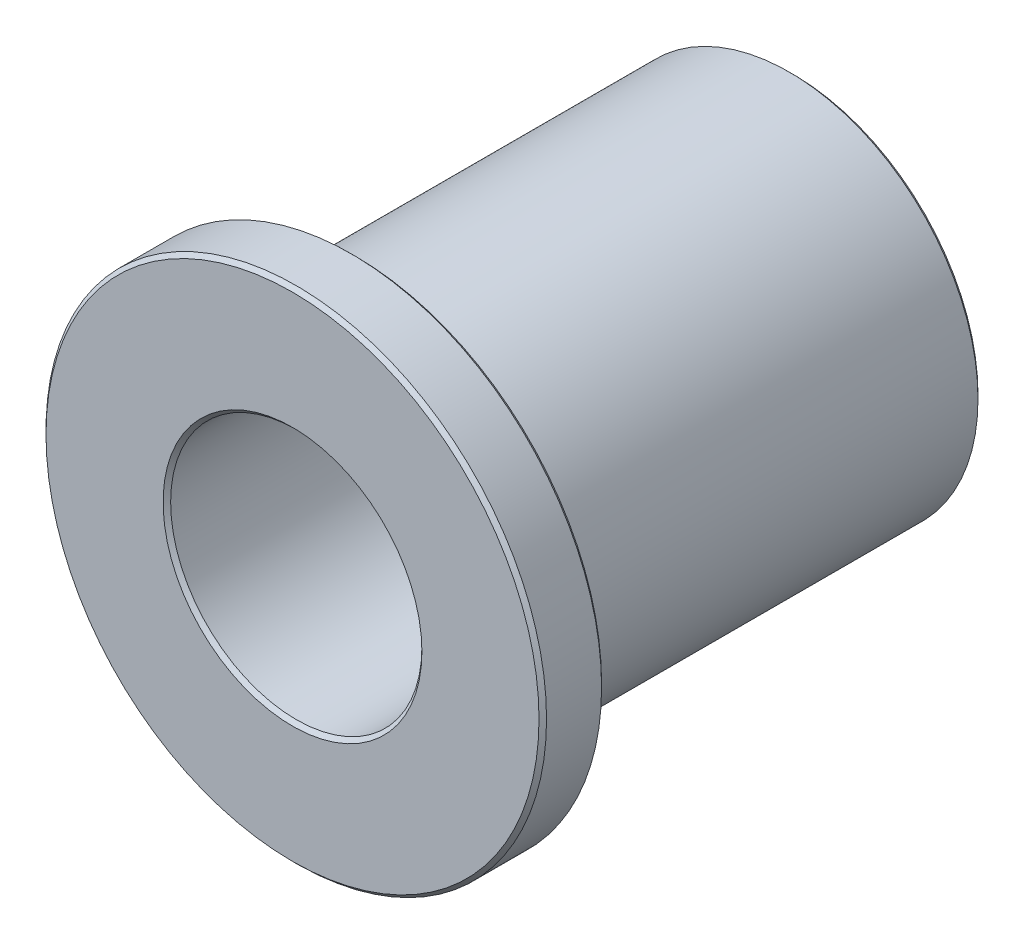
ISO-10303-21;
HEADER;
FILE_DESCRIPTION(('STEP AP214'),'2;1');
FILE_NAME('part.step','',(''),(''),'','','');
FILE_SCHEMA(('AUTOMOTIVE_DESIGN { 1 0 10303 214 1 1 1 1 }'));
ENDSEC;
DATA;
#1=APPLICATION_CONTEXT('core data for automotive mechanical design processes');
#2=APPLICATION_PROTOCOL_DEFINITION('international standard','automotive_design',2000,#1);
#3=PRODUCT_CONTEXT('',#1,'mechanical');
#4=PRODUCT('Part','Part','',(#3));
#5=PRODUCT_RELATED_PRODUCT_CATEGORY('part','',(#4));
#6=PRODUCT_DEFINITION_FORMATION('','',#4);
#7=PRODUCT_DEFINITION_CONTEXT('part definition',#1,'design');
#8=PRODUCT_DEFINITION('design','',#6,#7);
#9=PRODUCT_DEFINITION_SHAPE('','',#8);
#10=(LENGTH_UNIT() NAMED_UNIT(*) SI_UNIT(.MILLI.,.METRE.));
#11=(NAMED_UNIT(*) PLANE_ANGLE_UNIT() SI_UNIT($,.RADIAN.));
#12=(NAMED_UNIT(*) SI_UNIT($,.STERADIAN.) SOLID_ANGLE_UNIT());
#13=UNCERTAINTY_MEASURE_WITH_UNIT(LENGTH_MEASURE(1.E-05),#10,'distance_accuracy_value','');
#14=(GEOMETRIC_REPRESENTATION_CONTEXT(3) GLOBAL_UNCERTAINTY_ASSIGNED_CONTEXT((#13)) GLOBAL_UNIT_ASSIGNED_CONTEXT((#10,
#11,#12)) REPRESENTATION_CONTEXT('',''));
#15=CARTESIAN_POINT('',(0.,0.,0.));
#16=DIRECTION('',(0.,0.,1.));
#17=DIRECTION('',(1.,0.,0.));
#18=AXIS2_PLACEMENT_3D('',#15,#16,#17);
#19=CARTESIAN_POINT('',(0.,0.,4.7625));
#20=DIRECTION('',(0.,0.,1.));
#21=DIRECTION('',(1.,0.,0.));
#22=AXIS2_PLACEMENT_3D('',#19,#20,#21);
#23=CYLINDRICAL_SURFACE('',#22,6.35);
#24=CARTESIAN_POINT('',(0.,0.,6.254369));
#25=DIRECTION('',(0.,0.,1.));
#26=DIRECTION('',(1.,0.,0.));
#27=AXIS2_PLACEMENT_3D('',#24,#25,#26);
#28=CIRCLE('',#27,6.35);
#29=CARTESIAN_POINT('',(6.35,0.,6.254369));
#30=VERTEX_POINT('',#29);
#31=EDGE_CURVE('E56',#30,#30,#28,.F.);
#32=ORIENTED_EDGE('',*,*,#31,.T.);
#33=EDGE_LOOP('',(#32));
#34=FACE_BOUND('',#33,.T.);
#35=CARTESIAN_POINT('',(0.,0.,4.858131));
#36=DIRECTION('',(0.,0.,1.));
#37=DIRECTION('',(1.,0.,0.));
#38=AXIS2_PLACEMENT_3D('',#35,#36,#37);
#39=CIRCLE('',#38,6.35);
#40=CARTESIAN_POINT('',(6.35,0.,4.85813099999999));
#41=VERTEX_POINT('',#40);
#42=EDGE_CURVE('E59',#41,#41,#39,.T.);
#43=ORIENTED_EDGE('',*,*,#42,.T.);
#44=EDGE_LOOP('',(#43));
#45=FACE_BOUND('',#44,.T.);
#46=ADVANCED_FACE('F30',(#34,#45),#23,.T.);
#47=CARTESIAN_POINT('',(0.,0.,4.7625));
#48=DIRECTION('',(0.,0.,1.));
#49=DIRECTION('',(1.,0.,0.));
#50=AXIS2_PLACEMENT_3D('',#47,#48,#49);
#51=PLANE('',#50);
#52=CARTESIAN_POINT('',(0.,0.,4.7625));
#53=DIRECTION('',(0.,0.,1.));
#54=DIRECTION('',(1.,0.,0.));
#55=AXIS2_PLACEMENT_3D('',#52,#53,#54);
#56=CIRCLE('',#55,6.254369);
#57=CARTESIAN_POINT('',(6.254369,0.,4.7625));
#58=VERTEX_POINT('',#57);
#59=EDGE_CURVE('E50',#58,#58,#56,.F.);
#60=ORIENTED_EDGE('',*,*,#59,.T.);
#61=EDGE_LOOP('',(#60));
#62=FACE_BOUND('',#61,.T.);
#63=CARTESIAN_POINT('',(0.,0.,4.7625));
#64=DIRECTION('',(0.,0.,1.));
#65=DIRECTION('',(1.,0.,0.));
#66=AXIS2_PLACEMENT_3D('',#63,#64,#65);
#67=CIRCLE('',#66,4.883531);
#68=CARTESIAN_POINT('',(4.883531,0.,4.7625));
#69=VERTEX_POINT('',#68);
#70=EDGE_CURVE('E53',#69,#69,#67,.T.);
#71=ORIENTED_EDGE('',*,*,#70,.T.);
#72=EDGE_LOOP('',(#71));
#73=FACE_BOUND('',#72,.T.);
#74=ADVANCED_FACE('F90',(#62,#73),#51,.F.);
#75=CARTESIAN_POINT('',(0.,0.,6.35));
#76=DIRECTION('',(0.,0.,1.));
#77=DIRECTION('',(1.,0.,0.));
#78=AXIS2_PLACEMENT_3D('',#75,#76,#77);
#79=PLANE('',#78);
#80=CARTESIAN_POINT('',(0.,0.,6.35));
#81=DIRECTION('',(0.,0.,1.));
#82=DIRECTION('',(1.,0.,0.));
#83=AXIS2_PLACEMENT_3D('',#80,#81,#82);
#84=CIRCLE('',#83,3.283331);
#85=CARTESIAN_POINT('',(3.283331,0.,6.35));
#86=VERTEX_POINT('',#85);
#87=EDGE_CURVE('E62',#86,#86,#84,.F.);
#88=ORIENTED_EDGE('',*,*,#87,.T.);
#89=EDGE_LOOP('',(#88));
#90=FACE_BOUND('',#89,.T.);
#91=CARTESIAN_POINT('',(0.,0.,6.35));
#92=DIRECTION('',(0.,0.,1.));
#93=DIRECTION('',(1.,0.,0.));
#94=AXIS2_PLACEMENT_3D('',#91,#92,#93);
#95=CIRCLE('',#94,6.254369);
#96=CARTESIAN_POINT('',(6.254369,0.,6.35));
#97=VERTEX_POINT('',#96);
#98=EDGE_CURVE('E65',#97,#97,#95,.T.);
#99=ORIENTED_EDGE('',*,*,#98,.T.);
#100=EDGE_LOOP('',(#99));
#101=FACE_BOUND('',#100,.T.);
#102=ADVANCED_FACE('F96',(#90,#101),#79,.T.);
#103=CARTESIAN_POINT('',(0.,0.,4.7625));
#104=DIRECTION('',(0.,0.,1.));
#105=DIRECTION('',(1.,0.,0.));
#106=AXIS2_PLACEMENT_3D('',#103,#104,#105);
#107=CYLINDRICAL_SURFACE('',#106,3.1877);
#108=CARTESIAN_POINT('',(0.,0.,6.254369));
#109=DIRECTION('',(0.,0.,1.));
#110=DIRECTION('',(1.,0.,0.));
#111=AXIS2_PLACEMENT_3D('',#108,#109,#110);
#112=CIRCLE('',#111,3.1877);
#113=CARTESIAN_POINT('',(3.1877,0.,6.254369));
#114=VERTEX_POINT('',#113);
#115=EDGE_CURVE('E68',#114,#114,#112,.T.);
#116=ORIENTED_EDGE('',*,*,#115,.T.);
#117=EDGE_LOOP('',(#116));
#118=FACE_BOUND('',#117,.T.);
#119=CARTESIAN_POINT('',(0.,0.,-6.254369));
#120=DIRECTION('',(0.,0.,1.));
#121=DIRECTION('',(1.,0.,0.));
#122=AXIS2_PLACEMENT_3D('',#119,#120,#121);
#123=CIRCLE('',#122,3.1877);
#124=CARTESIAN_POINT('',(3.1877,0.,-6.254369));
#125=VERTEX_POINT('',#124);
#126=EDGE_CURVE('E71',#125,#125,#123,.F.);
#127=ORIENTED_EDGE('',*,*,#126,.T.);
#128=EDGE_LOOP('',(#127));
#129=FACE_BOUND('',#128,.T.);
#130=ADVANCED_FACE('F75',(#118,#129),#107,.F.);
#131=CARTESIAN_POINT('',(0.,0.,-6.35));
#132=DIRECTION('',(0.,0.,1.));
#133=DIRECTION('',(1.,0.,0.));
#134=AXIS2_PLACEMENT_3D('',#131,#132,#133);
#135=CYLINDRICAL_SURFACE('',#134,4.7879);
#136=CARTESIAN_POINT('',(0.,0.,4.666869));
#137=DIRECTION('',(0.,0.,1.));
#138=DIRECTION('',(1.,0.,0.));
#139=AXIS2_PLACEMENT_3D('',#136,#137,#138);
#140=CIRCLE('',#139,4.7879);
#141=CARTESIAN_POINT('',(4.7879,0.,4.666869));
#142=VERTEX_POINT('',#141);
#143=EDGE_CURVE('E41',#142,#142,#140,.F.);
#144=ORIENTED_EDGE('',*,*,#143,.T.);
#145=EDGE_LOOP('',(#144));
#146=FACE_BOUND('',#145,.T.);
#147=CARTESIAN_POINT('',(0.,0.,-6.254369));
#148=DIRECTION('',(0.,0.,1.));
#149=DIRECTION('',(1.,0.,0.));
#150=AXIS2_PLACEMENT_3D('',#147,#148,#149);
#151=CIRCLE('',#150,4.7879);
#152=CARTESIAN_POINT('',(4.7879,0.,-6.254369));
#153=VERTEX_POINT('',#152);
#154=EDGE_CURVE('E45',#153,#153,#151,.T.);
#155=ORIENTED_EDGE('',*,*,#154,.T.);
#156=EDGE_LOOP('',(#155));
#157=FACE_BOUND('',#156,.T.);
#158=ADVANCED_FACE('F158',(#146,#157),#135,.T.);
#159=CARTESIAN_POINT('',(0.,0.,-6.35));
#160=DIRECTION('',(0.,0.,1.));
#161=DIRECTION('',(1.,0.,0.));
#162=AXIS2_PLACEMENT_3D('',#159,#160,#161);
#163=PLANE('',#162);
#164=CARTESIAN_POINT('',(0.,0.,-6.35));
#165=DIRECTION('',(0.,0.,1.));
#166=DIRECTION('',(1.,0.,0.));
#167=AXIS2_PLACEMENT_3D('',#164,#165,#166);
#168=CIRCLE('',#167,3.283331);
#169=CARTESIAN_POINT('',(3.283331,0.,-6.35));
#170=VERTEX_POINT('',#169);
#171=EDGE_CURVE('E10',#170,#170,#168,.T.);
#172=ORIENTED_EDGE('',*,*,#171,.T.);
#173=EDGE_LOOP('',(#172));
#174=FACE_BOUND('',#173,.T.);
#175=CARTESIAN_POINT('',(0.,0.,-6.35));
#176=DIRECTION('',(0.,0.,1.));
#177=DIRECTION('',(1.,0.,0.));
#178=AXIS2_PLACEMENT_3D('',#175,#176,#177);
#179=CIRCLE('',#178,4.692269);
#180=CARTESIAN_POINT('',(4.692269,0.,-6.35));
#181=VERTEX_POINT('',#180);
#182=EDGE_CURVE('E37',#181,#181,#179,.F.);
#183=ORIENTED_EDGE('',*,*,#182,.T.);
#184=EDGE_LOOP('',(#183));
#185=FACE_BOUND('',#184,.T.);
#186=ADVANCED_FACE('F106',(#174,#185),#163,.F.);
#187=CARTESIAN_POINT('',(0.,0.,6.254369));
#188=DIRECTION('',(0.,0.,1.));
#189=DIRECTION('',(1.,0.,0.));
#190=AXIS2_PLACEMENT_3D('',#187,#188,#189);
#191=CONICAL_SURFACE('',#190,3.1877,0.785398163397446);
#192=ORIENTED_EDGE('',*,*,#87,.F.);
#193=EDGE_LOOP('',(#192));
#194=FACE_BOUND('',#193,.T.);
#195=ORIENTED_EDGE('',*,*,#115,.F.);
#196=EDGE_LOOP('',(#195));
#197=FACE_BOUND('',#196,.T.);
#198=ADVANCED_FACE('F102',(#194,#197),#191,.F.);
#199=CARTESIAN_POINT('',(0.,0.,6.35));
#200=DIRECTION('',(0.,0.,-1.));
#201=DIRECTION('',(-1.,0.,0.));
#202=AXIS2_PLACEMENT_3D('',#199,#200,#201);
#203=CONICAL_SURFACE('',#202,6.254369,0.785398163397471);
#204=ORIENTED_EDGE('',*,*,#31,.F.);
#205=EDGE_LOOP('',(#204));
#206=FACE_BOUND('',#205,.T.);
#207=ORIENTED_EDGE('',*,*,#98,.F.);
#208=EDGE_LOOP('',(#207));
#209=FACE_BOUND('',#208,.T.);
#210=ADVANCED_FACE('F105',(#206,#209),#203,.T.);
#211=CARTESIAN_POINT('',(0.,0.,4.858131));
#212=DIRECTION('',(0.,0.,1.));
#213=DIRECTION('',(1.,0.,0.));
#214=AXIS2_PLACEMENT_3D('',#211,#212,#213);
#215=CONICAL_SURFACE('',#214,6.35,0.785398163397453);
#216=CARTESIAN_POINT('',(6.254369,0.,4.7625));
#217=CARTESIAN_POINT('',(6.25536515625,0.,4.76349615625));
#218=CARTESIAN_POINT('',(6.2563613125,0.,4.7644923125));
#219=CARTESIAN_POINT('',(6.258353625,0.,4.766484625));
#220=CARTESIAN_POINT('',(6.25934978125,0.,4.76748078125));
#221=CARTESIAN_POINT('',(6.26134209375,0.,4.76947309375));
#222=CARTESIAN_POINT('',(6.26233825,0.,4.77046925));
#223=CARTESIAN_POINT('',(6.2643305625,0.,4.7724615625));
#224=CARTESIAN_POINT('',(6.26532671875,0.,4.77345771875));
#225=CARTESIAN_POINT('',(6.26731903125,0.,4.77545003125));
#226=CARTESIAN_POINT('',(6.2683151875,0.,4.7764461875));
#227=CARTESIAN_POINT('',(6.2703075,0.,4.7784385));
#228=CARTESIAN_POINT('',(6.27130365625,0.,4.77943465625));
#229=CARTESIAN_POINT('',(6.27329596875,0.,4.78142696875));
#230=CARTESIAN_POINT('',(6.274292125,0.,4.782423125));
#231=CARTESIAN_POINT('',(6.2762844375,0.,4.7844154375));
#232=CARTESIAN_POINT('',(6.27728059375,0.,4.78541159375));
#233=CARTESIAN_POINT('',(6.27927290625,0.,4.78740390625));
#234=CARTESIAN_POINT('',(6.2802690625,0.,4.7884000625));
#235=CARTESIAN_POINT('',(6.282261375,0.,4.790392375));
#236=CARTESIAN_POINT('',(6.28325753125,0.,4.79138853125));
#237=CARTESIAN_POINT('',(6.28524984375,0.,4.79338084375));
#238=CARTESIAN_POINT('',(6.286246,0.,4.794377));
#239=CARTESIAN_POINT('',(6.2882383125,0.,4.7963693125));
#240=CARTESIAN_POINT('',(6.28923446875,0.,4.79736546875));
#241=CARTESIAN_POINT('',(6.29122678125,0.,4.79935778125));
#242=CARTESIAN_POINT('',(6.2922229375,0.,4.8003539375));
#243=CARTESIAN_POINT('',(6.29421525,0.,4.80234625));
#244=CARTESIAN_POINT('',(6.29521140625,0.,4.80334240625));
#245=CARTESIAN_POINT('',(6.29720371875,0.,4.80533471875));
#246=CARTESIAN_POINT('',(6.298199875,0.,4.806330875));
#247=CARTESIAN_POINT('',(6.3001921875,0.,4.8083231875));
#248=CARTESIAN_POINT('',(6.30118834375,0.,4.80931934375));
#249=CARTESIAN_POINT('',(6.30318065625,0.,4.81131165625));
#250=CARTESIAN_POINT('',(6.3041768125,0.,4.81230781249999));
#251=CARTESIAN_POINT('',(6.306169125,0.,4.814300125));
#252=CARTESIAN_POINT('',(6.30716528125,0.,4.81529628125));
#253=CARTESIAN_POINT('',(6.30915759375,0.,4.81728859375));
#254=CARTESIAN_POINT('',(6.31015375,0.,4.81828474999999));
#255=CARTESIAN_POINT('',(6.3121460625,0.,4.8202770625));
#256=CARTESIAN_POINT('',(6.31314221875,0.,4.82127321875));
#257=CARTESIAN_POINT('',(6.31513453125,0.,4.82326553125));
#258=CARTESIAN_POINT('',(6.3161306875,0.,4.8242616875));
#259=CARTESIAN_POINT('',(6.318123,0.,4.826254));
#260=CARTESIAN_POINT('',(6.31911915625,0.,4.82725015625));
#261=CARTESIAN_POINT('',(6.32111146875,0.,4.82924246875));
#262=CARTESIAN_POINT('',(6.322107625,0.,4.830238625));
#263=CARTESIAN_POINT('',(6.3240999375,0.,4.8322309375));
#264=CARTESIAN_POINT('',(6.32509609375,0.,4.83322709375));
#265=CARTESIAN_POINT('',(6.32708840625,0.,4.83521940625));
#266=CARTESIAN_POINT('',(6.3280845625,0.,4.8362155625));
#267=CARTESIAN_POINT('',(6.330076875,0.,4.838207875));
#268=CARTESIAN_POINT('',(6.33107303125,0.,4.83920403125));
#269=CARTESIAN_POINT('',(6.33306534375,0.,4.84119634375));
#270=CARTESIAN_POINT('',(6.3340615,0.,4.8421925));
#271=CARTESIAN_POINT('',(6.3360538125,0.,4.8441848125));
#272=CARTESIAN_POINT('',(6.33704996875,0.,4.84518096874999));
#273=CARTESIAN_POINT('',(6.33904228125,0.,4.84717328125));
#274=CARTESIAN_POINT('',(6.3400384375,0.,4.8481694375));
#275=CARTESIAN_POINT('',(6.34203075,0.,4.85016175));
#276=CARTESIAN_POINT('',(6.34302690625,0.,4.85115790625));
#277=CARTESIAN_POINT('',(6.34501921875,0.,4.85315021875));
#278=CARTESIAN_POINT('',(6.346015375,0.,4.854146375));
#279=CARTESIAN_POINT('',(6.3480076875,0.,4.8561386875));
#280=CARTESIAN_POINT('',(6.34900384375,0.,4.85713484375));
#281=CARTESIAN_POINT('',(6.35,0.,4.858131));
#282=B_SPLINE_CURVE_WITH_KNOTS('',3,(#216,#217,#218,#219,#220,#221,#222,#223,#224,#225,#226,
#227,#228,#229,#230,#231,#232,#233,#234,#235,#236,#237,#238,#239,#240,#241,#242,#243,#244,#245,
#246,#247,#248,#249,#250,#251,#252,#253,#254,#255,#256,#257,#258,#259,#260,#261,#262,#263,#264,
#265,#266,#267,#268,#269,#270,#271,#272,#273,#274,#275,#276,#277,#278,#279,#280,#281),
.UNSPECIFIED.,.F.,.F.,(4,2,2,2,2,2,2,2,2,2,2,2,2,2,2,2,2,2,2,2,2,2,2,2,2,2,2,2,2,2,2,2,4),(0.,
0.00422633303697873,0.00845266607395624,0.012678999110935,0.0169053321479125,0.0211316651848912,
0.0253579982218687,0.0295843312588474,0.0338106642958249,0.0380369973328037,0.0422633303697812,
0.0464896634067599,0.050715996443738,0.0549423294807161,0.0591686625176936,0.0633949955546724,
0.0676213285916499,0.071847661628628,0.0760739946656061,0.0803003277025842,0.0845266607395624,
0.0887529937765405,0.0929793268135186,0.0972056598504967,0.101431992887475,0.105658325924453,
0.109884658961432,0.114110991998409,0.118337325035388,0.122563658072365,0.126789991109344,
0.131016324146322,0.1352426571833),.UNSPECIFIED.);
#283=EDGE_CURVE('BSEAM86',#58,#41,#282,.T.);
#284=ORIENTED_EDGE('',*,*,#59,.F.);
#285=ORIENTED_EDGE('',*,*,#42,.F.);
#286=ORIENTED_EDGE('',*,*,#283,.T.);
#287=ORIENTED_EDGE('',*,*,#283,.F.);
#288=EDGE_LOOP('',(#284,#286,#285,#287));
#289=FACE_BOUND('',#288,.T.);
#290=ADVANCED_FACE('F86',(#289),#215,.T.);
#291=CARTESIAN_POINT('',(0.,0.,4.7625));
#292=DIRECTION('',(0.,0.,1.));
#293=DIRECTION('',(1.,0.,0.));
#294=AXIS2_PLACEMENT_3D('',#291,#292,#293);
#295=CONICAL_SURFACE('',#294,4.883531,0.785398163397439);
#296=ORIENTED_EDGE('',*,*,#143,.F.);
#297=EDGE_LOOP('',(#296));
#298=FACE_BOUND('',#297,.T.);
#299=ORIENTED_EDGE('',*,*,#70,.F.);
#300=EDGE_LOOP('',(#299));
#301=FACE_BOUND('',#300,.T.);
#302=ADVANCED_FACE('F80',(#298,#301),#295,.T.);
#303=CARTESIAN_POINT('',(0.,0.,-6.35));
#304=DIRECTION('',(0.,0.,-1.));
#305=DIRECTION('',(-1.,0.,0.));
#306=AXIS2_PLACEMENT_3D('',#303,#304,#305);
#307=CONICAL_SURFACE('',#306,3.283331,0.785398163397453);
#308=ORIENTED_EDGE('',*,*,#126,.F.);
#309=EDGE_LOOP('',(#308));
#310=FACE_BOUND('',#309,.T.);
#311=ORIENTED_EDGE('',*,*,#171,.F.);
#312=EDGE_LOOP('',(#311));
#313=FACE_BOUND('',#312,.T.);
#314=ADVANCED_FACE('F77',(#310,#313),#307,.F.);
#315=CARTESIAN_POINT('',(0.,0.,-6.254369));
#316=DIRECTION('',(0.,0.,1.));
#317=DIRECTION('',(1.,0.,0.));
#318=AXIS2_PLACEMENT_3D('',#315,#316,#317);
#319=CONICAL_SURFACE('',#318,4.7879,0.785398163397444);
#320=ORIENTED_EDGE('',*,*,#182,.F.);
#321=EDGE_LOOP('',(#320));
#322=FACE_BOUND('',#321,.T.);
#323=ORIENTED_EDGE('',*,*,#154,.F.);
#324=EDGE_LOOP('',(#323));
#325=FACE_BOUND('',#324,.T.);
#326=ADVANCED_FACE('F32',(#322,#325),#319,.T.);
#327=CLOSED_SHELL('',(#46,#74,#102,#130,#158,#186,#198,#210,#290,#302,#314,#326));
#328=MANIFOLD_SOLID_BREP('B2',#327);
#329=ADVANCED_BREP_SHAPE_REPRESENTATION('',(#18,#328),#14);
#330=SHAPE_DEFINITION_REPRESENTATION(#9,#329);
ENDSEC;
END-ISO-10303-21;
